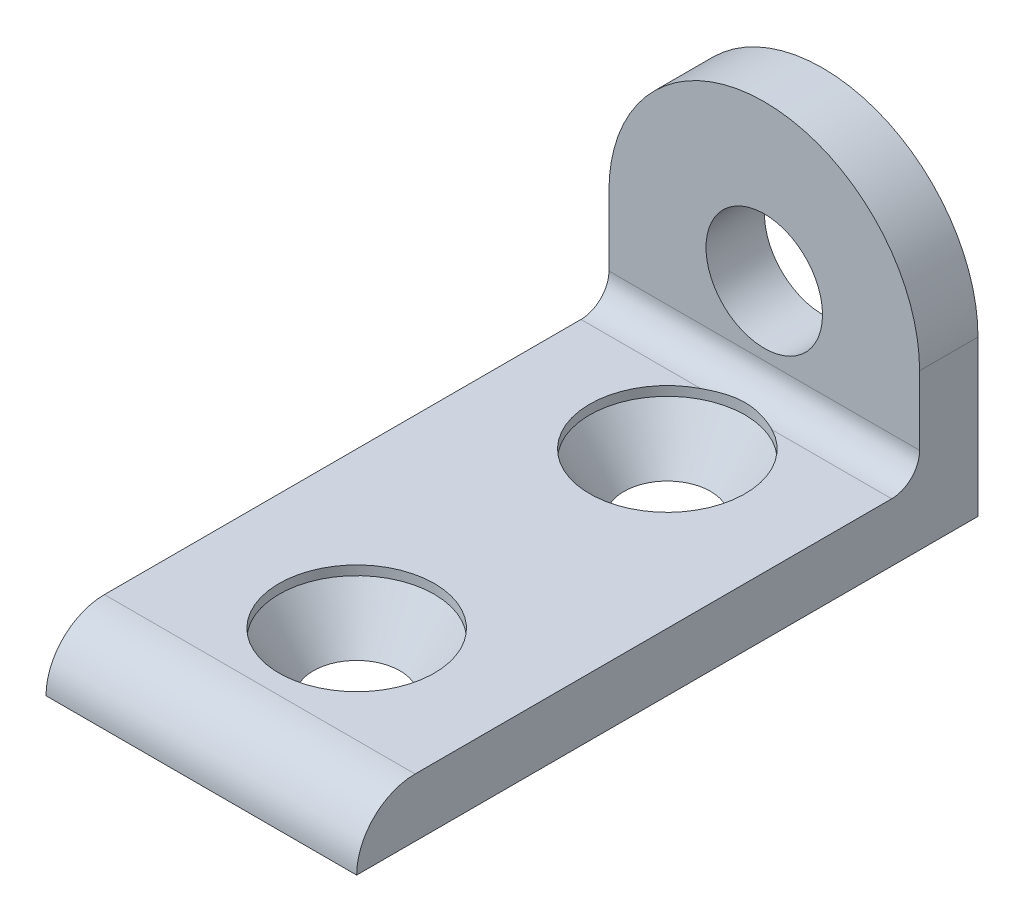
ISO-10303-21;
HEADER;
FILE_DESCRIPTION(('STEP AP214'),'2;1');
FILE_NAME('part.step','',(''),(''),'','','');
FILE_SCHEMA(('AUTOMOTIVE_DESIGN { 1 0 10303 214 1 1 1 1 }'));
ENDSEC;
DATA;
#1=APPLICATION_CONTEXT('core data for automotive mechanical design processes');
#2=APPLICATION_PROTOCOL_DEFINITION('international standard','automotive_design',2000,#1);
#3=PRODUCT_CONTEXT('',#1,'mechanical');
#4=PRODUCT('Part','Part','',(#3));
#5=PRODUCT_RELATED_PRODUCT_CATEGORY('part','',(#4));
#6=PRODUCT_DEFINITION_FORMATION('','',#4);
#7=PRODUCT_DEFINITION_CONTEXT('part definition',#1,'design');
#8=PRODUCT_DEFINITION('design','',#6,#7);
#9=PRODUCT_DEFINITION_SHAPE('','',#8);
#10=(LENGTH_UNIT() NAMED_UNIT(*) SI_UNIT(.MILLI.,.METRE.));
#11=(NAMED_UNIT(*) PLANE_ANGLE_UNIT() SI_UNIT($,.RADIAN.));
#12=(NAMED_UNIT(*) SI_UNIT($,.STERADIAN.) SOLID_ANGLE_UNIT());
#13=UNCERTAINTY_MEASURE_WITH_UNIT(LENGTH_MEASURE(1.E-05),#10,'distance_accuracy_value','');
#14=(GEOMETRIC_REPRESENTATION_CONTEXT(3) GLOBAL_UNCERTAINTY_ASSIGNED_CONTEXT((#13)) GLOBAL_UNIT_ASSIGNED_CONTEXT((#10,
#11,#12)) REPRESENTATION_CONTEXT('',''));
#15=CARTESIAN_POINT('',(0.,0.,0.));
#16=DIRECTION('',(0.,0.,1.));
#17=DIRECTION('',(1.,0.,0.));
#18=AXIS2_PLACEMENT_3D('',#15,#16,#17);
#19=CARTESIAN_POINT('',(-25.4,0.,50.8));
#20=DIRECTION('',(0.,-1.,0.));
#21=DIRECTION('',(0.,0.,-1.));
#22=AXIS2_PLACEMENT_3D('',#19,#20,#21);
#23=PLANE('',#22);
#24=CARTESIAN_POINT('',(-12.7,0.,38.1));
#25=DIRECTION('',(0.,-1.,0.));
#26=DIRECTION('',(0.,0.,-1.));
#27=AXIS2_PLACEMENT_3D('',#24,#25,#26);
#28=CIRCLE('',#27,3.53992710765681);
#29=CARTESIAN_POINT('',(-12.7,0.,34.5600728923432));
#30=VERTEX_POINT('',#29);
#31=EDGE_CURVE('E112',#30,#30,#28,.T.);
#32=ORIENTED_EDGE('',*,*,#31,.F.);
#33=EDGE_LOOP('',(#32));
#34=FACE_BOUND('',#33,.T.);
#35=DIRECTION('',(0.,0.,-1.));
#36=VECTOR('',#35,1.);
#37=CARTESIAN_POINT('',(0.,0.,50.8));
#38=LINE('',#37,#36);
#39=CARTESIAN_POINT('',(0.,0.,50.8));
#40=VERTEX_POINT('',#39);
#41=CARTESIAN_POINT('',(0.,0.,0.));
#42=VERTEX_POINT('',#41);
#43=EDGE_CURVE('E143',#40,#42,#38,.T.);
#44=ORIENTED_EDGE('',*,*,#43,.F.);
#45=DIRECTION('',(1.,0.,0.));
#46=VECTOR('',#45,1.);
#47=CARTESIAN_POINT('',(-25.4,0.,50.8));
#48=LINE('',#47,#46);
#49=CARTESIAN_POINT('',(-25.4,0.,50.8));
#50=VERTEX_POINT('',#49);
#51=EDGE_CURVE('E149',#50,#40,#48,.T.);
#52=ORIENTED_EDGE('',*,*,#51,.F.);
#53=DIRECTION('',(0.,0.,-1.));
#54=VECTOR('',#53,1.);
#55=CARTESIAN_POINT('',(-25.4,0.,50.8));
#56=LINE('',#55,#54);
#57=CARTESIAN_POINT('',(-25.4,0.,0.));
#58=VERTEX_POINT('',#57);
#59=EDGE_CURVE('E140',#50,#58,#56,.T.);
#60=ORIENTED_EDGE('',*,*,#59,.T.);
#61=DIRECTION('',(1.,0.,0.));
#62=VECTOR('',#61,1.);
#63=CARTESIAN_POINT('',(-25.4,0.,0.));
#64=LINE('',#63,#62);
#65=EDGE_CURVE('E150',#58,#42,#64,.T.);
#66=ORIENTED_EDGE('',*,*,#65,.T.);
#67=EDGE_LOOP('',(#44,#52,#60,#66));
#68=FACE_BOUND('',#67,.T.);
#69=CARTESIAN_POINT('',(-12.7,0.,12.7));
#70=DIRECTION('',(0.,-1.,0.));
#71=DIRECTION('',(0.,0.,-1.));
#72=AXIS2_PLACEMENT_3D('',#69,#70,#71);
#73=CIRCLE('',#72,3.53992710765681);
#74=CARTESIAN_POINT('',(-12.7,0.,9.1600728923432));
#75=VERTEX_POINT('',#74);
#76=EDGE_CURVE('E195',#75,#75,#73,.T.);
#77=ORIENTED_EDGE('',*,*,#76,.F.);
#78=EDGE_LOOP('',(#77));
#79=FACE_BOUND('',#78,.T.);
#80=ADVANCED_FACE('F33',(#34,#68,#79),#23,.T.);
#81=CARTESIAN_POINT('',(-25.4,4.7752,50.8));
#82=DIRECTION('',(0.,-1.,0.));
#83=DIRECTION('',(0.,0.,-1.));
#84=AXIS2_PLACEMENT_3D('',#81,#82,#83);
#85=PLANE('',#84);
#86=CARTESIAN_POINT('',(-12.7,4.7752,38.1));
#87=DIRECTION('',(0.,-1.,0.));
#88=DIRECTION('',(0.,0.,-1.));
#89=AXIS2_PLACEMENT_3D('',#86,#87,#88);
#90=CIRCLE('',#89,6.35);
#91=CARTESIAN_POINT('',(-12.7,4.7752,31.75));
#92=VERTEX_POINT('',#91);
#93=EDGE_CURVE('E185',#92,#92,#90,.T.);
#94=ORIENTED_EDGE('',*,*,#93,.T.);
#95=EDGE_LOOP('',(#94));
#96=FACE_BOUND('',#95,.T.);
#97=CARTESIAN_POINT('',(-12.7,4.7752,12.7));
#98=DIRECTION('',(0.,-1.,0.));
#99=DIRECTION('',(0.,0.,-1.));
#100=AXIS2_PLACEMENT_3D('',#97,#98,#99);
#101=CIRCLE('',#100,6.35);
#102=CARTESIAN_POINT('',(-15.6200059178022,4.7752,7.0612));
#103=VERTEX_POINT('',#102);
#104=CARTESIAN_POINT('',(-9.77999408219778,4.7752,7.0612));
#105=VERTEX_POINT('',#104);
#106=EDGE_CURVE('E52',#103,#105,#101,.F.);
#107=ORIENTED_EDGE('',*,*,#106,.F.);
#108=DIRECTION('',(1.,0.,0.));
#109=VECTOR('',#108,1.);
#110=CARTESIAN_POINT('',(-25.4,4.7752,7.0612));
#111=LINE('',#110,#109);
#112=CARTESIAN_POINT('',(-25.4,4.7752,7.0612));
#113=VERTEX_POINT('',#112);
#114=EDGE_CURVE('E109',#103,#113,#111,.F.);
#115=ORIENTED_EDGE('',*,*,#114,.T.);
#116=DIRECTION('',(0.,0.,-1.));
#117=VECTOR('',#116,1.);
#118=CARTESIAN_POINT('',(-25.4,4.7752,50.8));
#119=LINE('',#118,#117);
#120=CARTESIAN_POINT('',(-25.4,4.7752,46.0248));
#121=VERTEX_POINT('',#120);
#122=EDGE_CURVE('E132',#121,#113,#119,.T.);
#123=ORIENTED_EDGE('',*,*,#122,.F.);
#124=DIRECTION('',(1.,0.,0.));
#125=VECTOR('',#124,1.);
#126=CARTESIAN_POINT('',(-25.4,4.7752,46.0248));
#127=LINE('',#126,#125);
#128=CARTESIAN_POINT('',(0.,4.7752,46.0248));
#129=VERTEX_POINT('',#128);
#130=EDGE_CURVE('E162',#121,#129,#127,.T.);
#131=ORIENTED_EDGE('',*,*,#130,.T.);
#132=DIRECTION('',(0.,0.,-1.));
#133=VECTOR('',#132,1.);
#134=CARTESIAN_POINT('',(0.,4.7752,50.8));
#135=LINE('',#134,#133);
#136=CARTESIAN_POINT('',(0.,4.7752,7.0612));
#137=VERTEX_POINT('',#136);
#138=EDGE_CURVE('E175',#129,#137,#135,.T.);
#139=ORIENTED_EDGE('',*,*,#138,.T.);
#140=EDGE_CURVE('E111',#137,#105,#111,.F.);
#141=ORIENTED_EDGE('',*,*,#140,.T.);
#142=EDGE_LOOP('',(#107,#115,#123,#131,#139,#141));
#143=FACE_BOUND('',#142,.T.);
#144=ADVANCED_FACE('F107',(#96,#143),#85,.F.);
#145=CARTESIAN_POINT('',(-25.4,7.0612,7.0612));
#146=DIRECTION('',(-1.,0.,0.));
#147=DIRECTION('',(0.,0.,1.));
#148=AXIS2_PLACEMENT_3D('',#145,#146,#147);
#149=CYLINDRICAL_SURFACE('',#148,2.286);
#150=CARTESIAN_POINT('',(-7.71613257700756,5.5372,8.76508379885484));
#151=CARTESIAN_POINT('',(-7.7511431820258,5.48758462610129,8.72072065556148));
#152=CARTESIAN_POINT('',(-7.78825724902619,5.44078342823475,8.67494856361362));
#153=CARTESIAN_POINT('',(-7.86634895574411,5.35282195280284,8.58150798581989));
#154=CARTESIAN_POINT('',(-7.90732024083674,5.31165266220374,8.53384269135051));
#155=CARTESIAN_POINT('',(-7.99240153055475,5.23525329450206,8.43794789686322));
#156=CARTESIAN_POINT('',(-8.03646957707889,5.19995981856438,8.38973137011862));
#157=CARTESIAN_POINT('',(-8.12787926908092,5.13450308417875,8.29288669684253));
#158=CARTESIAN_POINT('',(-8.17522249444906,5.10434232628141,8.24425836172804));
#159=CARTESIAN_POINT('',(-8.28639891886336,5.04118598693248,8.13378243418187));
#160=CARTESIAN_POINT('',(-8.3511684210461,5.00971768418104,8.07200264988015));
#161=CARTESIAN_POINT('',(-8.48497873688837,4.95390593688056,7.94980858494418));
#162=CARTESIAN_POINT('',(-8.55402271065914,4.92956784175296,7.88939536076486));
#163=CARTESIAN_POINT('',(-8.69612425372592,4.88709961726497,7.77048679243534));
#164=CARTESIAN_POINT('',(-8.76919860661692,4.86899814520305,7.71200138973578));
#165=CARTESIAN_POINT('',(-8.9185621330889,4.83829431666985,7.59783678854932));
#166=CARTESIAN_POINT('',(-8.99485048693472,4.82569056719723,7.54215688237788));
#167=CARTESIAN_POINT('',(-9.18980321234445,4.7998979939399,7.40647561350709));
#168=CARTESIAN_POINT('',(-9.31028319041215,4.78967291397749,7.32851007544502));
#169=CARTESIAN_POINT('',(-9.55656347759792,4.77712478454896,7.18076416483283));
#170=CARTESIAN_POINT('',(-9.68236654148119,4.7748058785432,7.11098810270521));
#171=CARTESIAN_POINT('',(-9.9385195006605,4.7757014512549,6.98008436701216));
#172=CARTESIAN_POINT('',(-10.0688740781771,4.77892180305316,6.91896594721934));
#173=CARTESIAN_POINT('',(-10.3332875277116,4.78880439859729,6.80577767935448));
#174=CARTESIAN_POINT('',(-10.4673459332841,4.79546621079252,6.75370669784982));
#175=CARTESIAN_POINT('',(-10.7464064250459,4.81081120713999,6.65607233392074));
#176=CARTESIAN_POINT('',(-10.891594488816,4.81958860955689,6.61105544740053));
#177=CARTESIAN_POINT('',(-11.1848330945252,4.83703317926904,6.53154407813853));
#178=CARTESIAN_POINT('',(-11.332883719285,4.84570034336278,6.49704990032938));
#179=CARTESIAN_POINT('',(-11.6309366366126,4.86135327144086,6.43880035692942));
#180=CARTESIAN_POINT('',(-11.780935516273,4.86834164280579,6.41502828746415));
#181=CARTESIAN_POINT('',(-12.0823599461852,4.87950539265828,6.37828542451924));
#182=CARTESIAN_POINT('',(-12.233785544655,4.88368067572514,6.36531499743067));
#183=CARTESIAN_POINT('',(-12.5621336506332,4.88893930294228,6.34903548909424));
#184=CARTESIAN_POINT('',(-12.7391661484152,4.88940349965524,6.3476590070274));
#185=CARTESIAN_POINT('',(-13.0926884148756,4.88549122100433,6.35968557188274));
#186=CARTESIAN_POINT('',(-13.2691781037253,4.88111406486029,6.37309069736058));
#187=CARTESIAN_POINT('',(-13.6207967682565,4.86844083157447,6.41461469900974));
#188=CARTESIAN_POINT('',(-13.7959201720893,4.86013319632891,6.44277699708221));
#189=CARTESIAN_POINT('',(-14.1430785523321,4.84145245892967,6.51361076702985));
#190=CARTESIAN_POINT('',(-14.3151136487237,4.83107943720702,6.55628167395122));
#191=CARTESIAN_POINT('',(-14.6526641563219,4.81099261665628,6.65515944142476));
#192=CARTESIAN_POINT('',(-14.8182371449651,4.80127161732766,6.71116825561891));
#193=CARTESIAN_POINT('',(-15.1444248867502,4.78536588072078,6.83673846151085));
#194=CARTESIAN_POINT('',(-15.3050379711234,4.77918232161764,6.90630435818235));
#195=CARTESIAN_POINT('',(-15.6195517883072,4.77394247809868,7.05827223378531));
#196=CARTESIAN_POINT('',(-15.7734743818202,4.77486089860082,7.14062763395085));
#197=CARTESIAN_POINT('',(-16.0735548232886,4.7878780283139,7.31744317255367));
#198=CARTESIAN_POINT('',(-16.2197214044535,4.79996386794041,7.41188926949165));
#199=CARTESIAN_POINT('',(-16.4998746655799,4.83971035363107,7.60959794187618));
#200=CARTESIAN_POINT('',(-16.6340385134125,4.86707428881199,7.71266166969406));
#201=CARTESIAN_POINT('',(-16.8260681221696,4.9232569834484,7.87247315317906));
#202=CARTESIAN_POINT('',(-16.8884544315046,4.94446384270963,7.92652718585897));
#203=CARTESIAN_POINT('',(-17.009866573299,4.99252912427272,8.03585976226268));
#204=CARTESIAN_POINT('',(-17.0688940413782,5.01938476539976,8.0911376914623));
#205=CARTESIAN_POINT('',(-17.1799850272594,5.07764833717448,8.19912253886294));
#206=CARTESIAN_POINT('',(-17.232253377226,5.1087179388151,8.25180047352836));
#207=CARTESIAN_POINT('',(-17.3330354704138,5.17680250959441,8.35686968734414));
#208=CARTESIAN_POINT('',(-17.3815510048487,5.21381461611245,8.40926109201875));
#209=CARTESIAN_POINT('',(-17.4750730833868,5.2946226304492,8.51357775269169));
#210=CARTESIAN_POINT('',(-17.5200263353064,5.33849983224427,8.56548829496178));
#211=CARTESIAN_POINT('',(-17.605440516556,5.43286890915221,8.6671807603194));
#212=CARTESIAN_POINT('',(-17.6458926114571,5.48337338272573,8.7169583834077));
#213=CARTESIAN_POINT('',(-17.6838674229925,5.53719999999994,8.76508379885485));
#214=B_SPLINE_CURVE_WITH_KNOTS('',3,(#150,#151,#152,#153,#154,#155,#156,#157,#158,#159,#160,
#161,#162,#163,#164,#165,#166,#167,#168,#169,#170,#171,#172,#173,#174,#175,#176,#177,#178,#179,
#180,#181,#182,#183,#184,#185,#186,#187,#188,#189,#190,#191,#192,#193,#194,#195,#196,#197,#198,
#199,#200,#201,#202,#203,#204,#205,#206,#207,#208,#209,#210,#211,#212,#213),.UNSPECIFIED.,.F.,
.F.,(4,2,2,2,2,2,2,2,2,2,2,2,2,2,2,2,2,2,2,2,2,2,2,2,2,2,2,2,2,2,2,4),(0.,0.225448744583732,
0.450532362087952,0.673003036050992,0.895581784615139,1.17978788838788,1.46420667425905,
1.74991545996576,2.03555181127404,2.46648734028687,2.89764867890718,3.32926744461033,
3.76083209951932,4.2172168773049,4.67361487919458,5.12929938593628,5.58499934884047,
6.11541071825334,6.64589668240549,7.17795240106448,7.70998740426534,8.23456743424859,
8.75932207859194,9.28220857031552,9.80449322644818,10.3169708924666,10.5724372044793,
10.8277780309747,11.0688474263055,11.3098010403119,11.5538605636305,11.7983909544355),.UNSPECIFIED.);
#215=EDGE_CURVE('E11',#105,#103,#214,.T.);
#216=ORIENTED_EDGE('',*,*,#215,.F.);
#217=ORIENTED_EDGE('',*,*,#140,.F.);
#218=CARTESIAN_POINT('',(0.,7.0612,7.0612));
#219=DIRECTION('',(-1.,0.,0.));
#220=DIRECTION('',(0.,0.,1.));
#221=AXIS2_PLACEMENT_3D('',#218,#219,#220);
#222=CIRCLE('',#221,2.286);
#223=CARTESIAN_POINT('',(0.,7.0612,4.7752));
#224=VERTEX_POINT('',#223);
#225=EDGE_CURVE('E60',#224,#137,#222,.T.);
#226=ORIENTED_EDGE('',*,*,#225,.F.);
#227=DIRECTION('',(1.,0.,0.));
#228=VECTOR('',#227,1.);
#229=CARTESIAN_POINT('',(0.,7.0612,4.7752));
#230=LINE('',#229,#228);
#231=CARTESIAN_POINT('',(-25.4,7.0612,4.7752));
#232=VERTEX_POINT('',#231);
#233=EDGE_CURVE('E118',#232,#224,#230,.T.);
#234=ORIENTED_EDGE('',*,*,#233,.F.);
#235=CARTESIAN_POINT('',(-25.4,7.0612,7.0612));
#236=DIRECTION('',(-1.,0.,0.));
#237=DIRECTION('',(0.,0.,1.));
#238=AXIS2_PLACEMENT_3D('',#235,#236,#237);
#239=CIRCLE('',#238,2.286);
#240=EDGE_CURVE('E47',#113,#232,#239,.F.);
#241=ORIENTED_EDGE('',*,*,#240,.F.);
#242=ORIENTED_EDGE('',*,*,#114,.F.);
#243=EDGE_LOOP('',(#216,#217,#226,#234,#241,#242));
#244=FACE_BOUND('',#243,.T.);
#245=ADVANCED_FACE('F116',(#244),#149,.F.);
#246=CARTESIAN_POINT('',(-12.7,12.7,0.));
#247=DIRECTION('',(0.,0.,-1.));
#248=DIRECTION('',(-1.,0.,0.));
#249=AXIS2_PLACEMENT_3D('',#246,#247,#248);
#250=CYLINDRICAL_SURFACE('',#249,12.7);
#251=DIRECTION('',(0.,0.,-1.));
#252=VECTOR('',#251,1.);
#253=CARTESIAN_POINT('',(0.,12.7,0.));
#254=LINE('',#253,#252);
#255=CARTESIAN_POINT('',(0.,12.7,0.));
#256=VERTEX_POINT('',#255);
#257=CARTESIAN_POINT('',(0.,12.7,4.7752));
#258=VERTEX_POINT('',#257);
#259=EDGE_CURVE('E152',#256,#258,#254,.F.);
#260=ORIENTED_EDGE('',*,*,#259,.F.);
#261=CARTESIAN_POINT('',(-12.7,12.7,0.));
#262=DIRECTION('',(0.,0.,-1.));
#263=DIRECTION('',(-1.,0.,0.));
#264=AXIS2_PLACEMENT_3D('',#261,#262,#263);
#265=CIRCLE('',#264,12.7);
#266=CARTESIAN_POINT('',(-25.4,12.7,0.));
#267=VERTEX_POINT('',#266);
#268=EDGE_CURVE('E159',#267,#256,#265,.T.);
#269=ORIENTED_EDGE('',*,*,#268,.F.);
#270=DIRECTION('',(0.,0.,1.));
#271=VECTOR('',#270,1.);
#272=CARTESIAN_POINT('',(-25.4,12.7,0.));
#273=LINE('',#272,#271);
#274=CARTESIAN_POINT('',(-25.4,12.7,4.7752));
#275=VERTEX_POINT('',#274);
#276=EDGE_CURVE('E157',#275,#267,#273,.F.);
#277=ORIENTED_EDGE('',*,*,#276,.F.);
#278=CARTESIAN_POINT('',(-12.7,12.7,4.7752));
#279=DIRECTION('',(0.,0.,-1.));
#280=DIRECTION('',(-1.,0.,0.));
#281=AXIS2_PLACEMENT_3D('',#278,#279,#280);
#282=CIRCLE('',#281,12.7);
#283=EDGE_CURVE('E136',#258,#275,#282,.F.);
#284=ORIENTED_EDGE('',*,*,#283,.F.);
#285=EDGE_LOOP('',(#260,#269,#277,#284));
#286=FACE_BOUND('',#285,.T.);
#287=ADVANCED_FACE('F35',(#286),#250,.T.);
#288=CARTESIAN_POINT('',(-25.4,0.,0.));
#289=DIRECTION('',(0.,0.,-1.));
#290=DIRECTION('',(-1.,0.,0.));
#291=AXIS2_PLACEMENT_3D('',#288,#289,#290);
#292=PLANE('',#291);
#293=CARTESIAN_POINT('',(-12.7,12.7,0.));
#294=DIRECTION('',(0.,0.,1.));
#295=DIRECTION('',(1.,0.,0.));
#296=AXIS2_PLACEMENT_3D('',#293,#294,#295);
#297=CIRCLE('',#296,4.7625);
#298=CARTESIAN_POINT('',(-7.9375,12.7,0.));
#299=VERTEX_POINT('',#298);
#300=EDGE_CURVE('E198',#299,#299,#297,.T.);
#301=ORIENTED_EDGE('',*,*,#300,.T.);
#302=EDGE_LOOP('',(#301));
#303=FACE_BOUND('',#302,.T.);
#304=DIRECTION('',(0.,1.,0.));
#305=VECTOR('',#304,1.);
#306=CARTESIAN_POINT('',(-25.4,0.,0.));
#307=LINE('',#306,#305);
#308=EDGE_CURVE('E138',#58,#267,#307,.T.);
#309=ORIENTED_EDGE('',*,*,#308,.T.);
#310=ORIENTED_EDGE('',*,*,#268,.T.);
#311=DIRECTION('',(0.,1.,0.));
#312=VECTOR('',#311,1.);
#313=CARTESIAN_POINT('',(0.,0.,0.));
#314=LINE('',#313,#312);
#315=EDGE_CURVE('E183',#42,#256,#314,.T.);
#316=ORIENTED_EDGE('',*,*,#315,.F.);
#317=ORIENTED_EDGE('',*,*,#65,.F.);
#318=EDGE_LOOP('',(#309,#310,#316,#317));
#319=FACE_BOUND('',#318,.T.);
#320=ADVANCED_FACE('F208',(#303,#319),#292,.T.);
#321=CARTESIAN_POINT('',(-25.4,0.,4.7752));
#322=DIRECTION('',(0.,0.,-1.));
#323=DIRECTION('',(-1.,0.,0.));
#324=AXIS2_PLACEMENT_3D('',#321,#322,#323);
#325=PLANE('',#324);
#326=CARTESIAN_POINT('',(-12.7,12.7,4.7752));
#327=DIRECTION('',(0.,0.,1.));
#328=DIRECTION('',(1.,0.,0.));
#329=AXIS2_PLACEMENT_3D('',#326,#327,#328);
#330=CIRCLE('',#329,4.7625);
#331=CARTESIAN_POINT('',(-7.9375,12.7,4.7752));
#332=VERTEX_POINT('',#331);
#333=EDGE_CURVE('E201',#332,#332,#330,.T.);
#334=ORIENTED_EDGE('',*,*,#333,.F.);
#335=EDGE_LOOP('',(#334));
#336=FACE_BOUND('',#335,.T.);
#337=DIRECTION('',(0.,1.,0.));
#338=VECTOR('',#337,1.);
#339=CARTESIAN_POINT('',(-25.4,0.,4.7752));
#340=LINE('',#339,#338);
#341=EDGE_CURVE('E130',#232,#275,#340,.T.);
#342=ORIENTED_EDGE('',*,*,#341,.F.);
#343=ORIENTED_EDGE('',*,*,#233,.T.);
#344=DIRECTION('',(0.,1.,0.));
#345=VECTOR('',#344,1.);
#346=CARTESIAN_POINT('',(0.,0.,4.7752));
#347=LINE('',#346,#345);
#348=EDGE_CURVE('E179',#224,#258,#347,.T.);
#349=ORIENTED_EDGE('',*,*,#348,.T.);
#350=ORIENTED_EDGE('',*,*,#283,.T.);
#351=EDGE_LOOP('',(#342,#343,#349,#350));
#352=FACE_BOUND('',#351,.T.);
#353=ADVANCED_FACE('F134',(#336,#352),#325,.F.);
#354=CARTESIAN_POINT('',(-25.4,25.4,0.));
#355=DIRECTION('',(-1.,0.,0.));
#356=DIRECTION('',(0.,0.,1.));
#357=AXIS2_PLACEMENT_3D('',#354,#355,#356);
#358=PLANE('',#357);
#359=ORIENTED_EDGE('',*,*,#59,.F.);
#360=CARTESIAN_POINT('',(-25.4,0.,46.0248));
#361=DIRECTION('',(-1.,0.,0.));
#362=DIRECTION('',(0.,0.,1.));
#363=AXIS2_PLACEMENT_3D('',#360,#361,#362);
#364=CIRCLE('',#363,4.7752);
#365=EDGE_CURVE('E121',#50,#121,#364,.T.);
#366=ORIENTED_EDGE('',*,*,#365,.T.);
#367=ORIENTED_EDGE('',*,*,#122,.T.);
#368=ORIENTED_EDGE('',*,*,#240,.T.);
#369=ORIENTED_EDGE('',*,*,#341,.T.);
#370=ORIENTED_EDGE('',*,*,#276,.T.);
#371=ORIENTED_EDGE('',*,*,#308,.F.);
#372=EDGE_LOOP('',(#359,#366,#367,#368,#369,#370,#371));
#373=FACE_BOUND('',#372,.T.);
#374=ADVANCED_FACE('F128',(#373),#358,.T.);
#375=CARTESIAN_POINT('',(0.,25.4,0.));
#376=DIRECTION('',(-1.,0.,0.));
#377=DIRECTION('',(0.,0.,1.));
#378=AXIS2_PLACEMENT_3D('',#375,#376,#377);
#379=PLANE('',#378);
#380=ORIENTED_EDGE('',*,*,#138,.F.);
#381=CARTESIAN_POINT('',(0.,0.,46.0248));
#382=DIRECTION('',(-1.,0.,0.));
#383=DIRECTION('',(0.,0.,1.));
#384=AXIS2_PLACEMENT_3D('',#381,#382,#383);
#385=CIRCLE('',#384,4.7752);
#386=EDGE_CURVE('E165',#129,#40,#385,.F.);
#387=ORIENTED_EDGE('',*,*,#386,.T.);
#388=ORIENTED_EDGE('',*,*,#43,.T.);
#389=ORIENTED_EDGE('',*,*,#315,.T.);
#390=ORIENTED_EDGE('',*,*,#259,.T.);
#391=ORIENTED_EDGE('',*,*,#348,.F.);
#392=ORIENTED_EDGE('',*,*,#225,.T.);
#393=EDGE_LOOP('',(#380,#387,#388,#389,#390,#391,#392));
#394=FACE_BOUND('',#393,.T.);
#395=ADVANCED_FACE('F173',(#394),#379,.F.);
#396=CARTESIAN_POINT('',(-25.4,0.,46.0248));
#397=DIRECTION('',(1.,0.,0.));
#398=DIRECTION('',(0.,0.,-1.));
#399=AXIS2_PLACEMENT_3D('',#396,#397,#398);
#400=CYLINDRICAL_SURFACE('',#399,4.7752);
#401=ORIENTED_EDGE('',*,*,#365,.F.);
#402=ORIENTED_EDGE('',*,*,#51,.T.);
#403=ORIENTED_EDGE('',*,*,#386,.F.);
#404=ORIENTED_EDGE('',*,*,#130,.F.);
#405=EDGE_LOOP('',(#401,#402,#403,#404));
#406=FACE_BOUND('',#405,.T.);
#407=ADVANCED_FACE('F170',(#406),#400,.T.);
#408=CARTESIAN_POINT('',(-12.7,0.,38.1));
#409=DIRECTION('',(0.,-1.,0.));
#410=DIRECTION('',(0.,0.,-1.));
#411=AXIS2_PLACEMENT_3D('',#408,#409,#410);
#412=CYLINDRICAL_SURFACE('',#411,6.35);
#413=CARTESIAN_POINT('',(-12.7,4.0132,38.1));
#414=DIRECTION('',(0.,-1.,0.));
#415=DIRECTION('',(0.,0.,-1.));
#416=AXIS2_PLACEMENT_3D('',#413,#414,#415);
#417=CIRCLE('',#416,6.35000000000001);
#418=CARTESIAN_POINT('',(-12.7,4.0132,31.75));
#419=VERTEX_POINT('',#418);
#420=EDGE_CURVE('E188',#419,#419,#417,.T.);
#421=ORIENTED_EDGE('',*,*,#420,.T.);
#422=EDGE_LOOP('',(#421));
#423=FACE_BOUND('',#422,.T.);
#424=ORIENTED_EDGE('',*,*,#93,.F.);
#425=EDGE_LOOP('',(#424));
#426=FACE_BOUND('',#425,.T.);
#427=ADVANCED_FACE('F230',(#423,#426),#412,.F.);
#428=CARTESIAN_POINT('',(-12.7,4.0132,38.1));
#429=DIRECTION('',(0.,1.,0.));
#430=DIRECTION('',(0.,0.,1.));
#431=AXIS2_PLACEMENT_3D('',#428,#429,#430);
#432=CONICAL_SURFACE('',#431,6.35000000000001,0.610865238198014);
#433=ORIENTED_EDGE('',*,*,#31,.T.);
#434=EDGE_LOOP('',(#433));
#435=FACE_BOUND('',#434,.T.);
#436=ORIENTED_EDGE('',*,*,#420,.F.);
#437=EDGE_LOOP('',(#436));
#438=FACE_BOUND('',#437,.T.);
#439=ADVANCED_FACE('F233',(#435,#438),#432,.F.);
#440=CARTESIAN_POINT('',(-12.7,0.,12.7));
#441=DIRECTION('',(0.,-1.,0.));
#442=DIRECTION('',(0.,0.,-1.));
#443=AXIS2_PLACEMENT_3D('',#440,#441,#442);
#444=CYLINDRICAL_SURFACE('',#443,6.35);
#445=CARTESIAN_POINT('',(-12.7,4.0132,12.7));
#446=DIRECTION('',(0.,-1.,0.));
#447=DIRECTION('',(0.,0.,-1.));
#448=AXIS2_PLACEMENT_3D('',#445,#446,#447);
#449=CIRCLE('',#448,6.35);
#450=CARTESIAN_POINT('',(-12.7,4.0132,6.35));
#451=VERTEX_POINT('',#450);
#452=EDGE_CURVE('E113',#451,#451,#449,.T.);
#453=ORIENTED_EDGE('',*,*,#452,.T.);
#454=EDGE_LOOP('',(#453));
#455=FACE_BOUND('',#454,.T.);
#456=ORIENTED_EDGE('',*,*,#106,.T.);
#457=ORIENTED_EDGE('',*,*,#215,.T.);
#458=EDGE_LOOP('',(#456,#457));
#459=FACE_BOUND('',#458,.T.);
#460=ADVANCED_FACE('F101',(#455,#459),#444,.F.);
#461=CARTESIAN_POINT('',(-12.7,4.0132,12.7));
#462=DIRECTION('',(0.,1.,0.));
#463=DIRECTION('',(0.,0.,1.));
#464=AXIS2_PLACEMENT_3D('',#461,#462,#463);
#465=CONICAL_SURFACE('',#464,6.35,0.610865238198013);
#466=ORIENTED_EDGE('',*,*,#76,.T.);
#467=EDGE_LOOP('',(#466));
#468=FACE_BOUND('',#467,.T.);
#469=ORIENTED_EDGE('',*,*,#452,.F.);
#470=EDGE_LOOP('',(#469));
#471=FACE_BOUND('',#470,.T.);
#472=ADVANCED_FACE('F242',(#468,#471),#465,.F.);
#473=CARTESIAN_POINT('',(-12.7,12.7,0.));
#474=DIRECTION('',(0.,0.,1.));
#475=DIRECTION('',(1.,0.,0.));
#476=AXIS2_PLACEMENT_3D('',#473,#474,#475);
#477=CYLINDRICAL_SURFACE('',#476,4.7625);
#478=ORIENTED_EDGE('',*,*,#300,.F.);
#479=EDGE_LOOP('',(#478));
#480=FACE_BOUND('',#479,.T.);
#481=ORIENTED_EDGE('',*,*,#333,.T.);
#482=EDGE_LOOP('',(#481));
#483=FACE_BOUND('',#482,.T.);
#484=ADVANCED_FACE('F205',(#480,#483),#477,.F.);
#485=CLOSED_SHELL('',(#80,#144,#245,#287,#320,#353,#374,#395,#407,#427,#439,#460,#472,#484));
#486=MANIFOLD_SOLID_BREP('B2',#485);
#487=ADVANCED_BREP_SHAPE_REPRESENTATION('',(#18,#486),#14);
#488=SHAPE_DEFINITION_REPRESENTATION(#9,#487);
ENDSEC;
END-ISO-10303-21;
